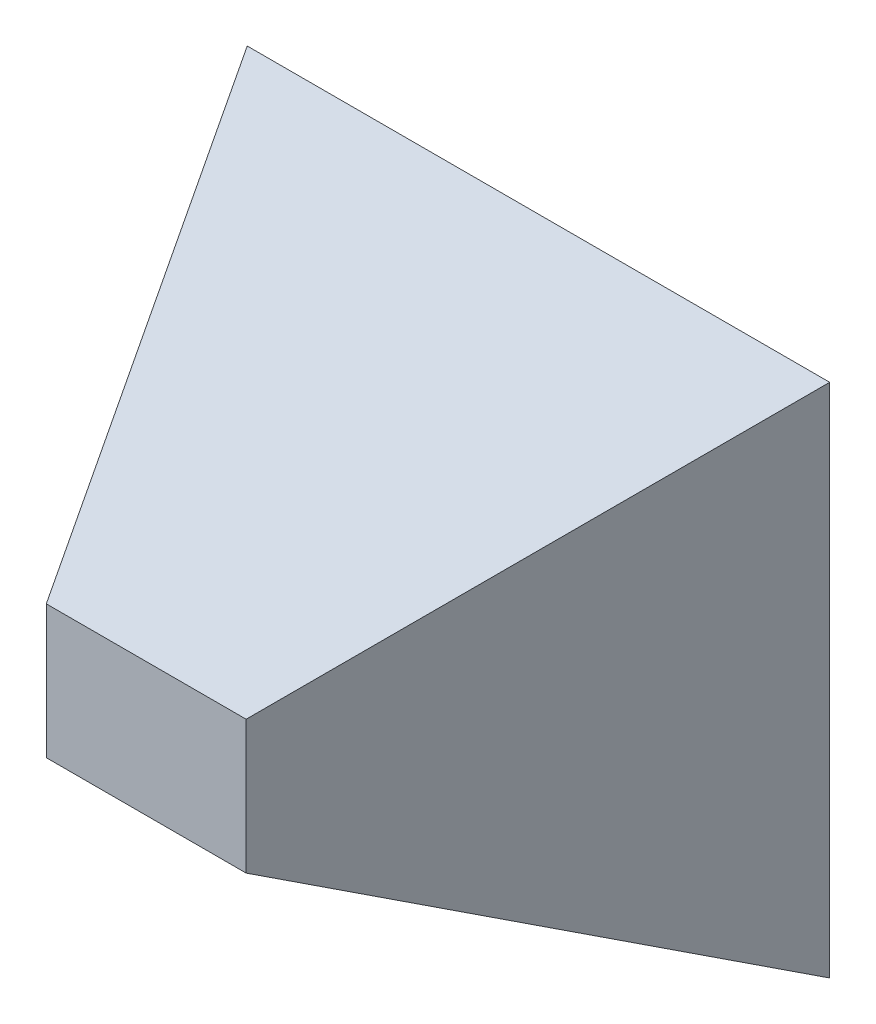
ISO-10303-21;
HEADER;
FILE_DESCRIPTION(('STEP AP214'),'2;1');
FILE_NAME('part.step','',(''),(''),'','','');
FILE_SCHEMA(('AUTOMOTIVE_DESIGN { 1 0 10303 214 1 1 1 1 }'));
ENDSEC;
DATA;
#1=APPLICATION_CONTEXT('core data for automotive mechanical design processes');
#2=APPLICATION_PROTOCOL_DEFINITION('international standard','automotive_design',2000,#1);
#3=PRODUCT_CONTEXT('',#1,'mechanical');
#4=PRODUCT('Part','Part','',(#3));
#5=PRODUCT_RELATED_PRODUCT_CATEGORY('part','',(#4));
#6=PRODUCT_DEFINITION_FORMATION('','',#4);
#7=PRODUCT_DEFINITION_CONTEXT('part definition',#1,'design');
#8=PRODUCT_DEFINITION('design','',#6,#7);
#9=PRODUCT_DEFINITION_SHAPE('','',#8);
#10=(LENGTH_UNIT() NAMED_UNIT(*) SI_UNIT(.MILLI.,.METRE.));
#11=(NAMED_UNIT(*) PLANE_ANGLE_UNIT() SI_UNIT($,.RADIAN.));
#12=(NAMED_UNIT(*) SI_UNIT($,.STERADIAN.) SOLID_ANGLE_UNIT());
#13=UNCERTAINTY_MEASURE_WITH_UNIT(LENGTH_MEASURE(1.E-05),#10,'distance_accuracy_value','');
#14=(GEOMETRIC_REPRESENTATION_CONTEXT(3) GLOBAL_UNCERTAINTY_ASSIGNED_CONTEXT((#13)) GLOBAL_UNIT_ASSIGNED_CONTEXT((#10,
#11,#12)) REPRESENTATION_CONTEXT('',''));
#15=CARTESIAN_POINT('',(0.,0.,0.));
#16=DIRECTION('',(0.,0.,1.));
#17=DIRECTION('',(1.,0.,0.));
#18=AXIS2_PLACEMENT_3D('',#15,#16,#17);
#19=CARTESIAN_POINT('',(-174.101205953701,-155.,-0.438371146789078));
#20=DIRECTION('',(-0.898794046299166,0.,0.438371146789078));
#21=DIRECTION('',(0.438371146789078,0.,0.898794046299167));
#22=AXIS2_PLACEMENT_3D('',#19,#20,#21);
#23=PLANE('',#22);
#24=DIRECTION('',(0.,-1.,0.));
#25=VECTOR('',#24,1.);
#26=CARTESIAN_POINT('',(-173.,-155.,1.81943565045367));
#27=LINE('',#26,#25);
#28=CARTESIAN_POINT('',(-173.,-153.,1.81943565045362));
#29=VERTEX_POINT('',#28);
#30=CARTESIAN_POINT('',(-173.,153.,1.81943565045401));
#31=VERTEX_POINT('',#30);
#32=EDGE_CURVE('E174',#29,#31,#27,.F.);
#33=ORIENTED_EDGE('',*,*,#32,.F.);
#34=DIRECTION('',(-0.401488399504229,-0.401488399504229,-0.823173207853041));
#35=VECTOR('',#34,1.);
#36=CARTESIAN_POINT('',(-117.828557976164,-97.8285579761638,114.937655177394));
#37=LINE('',#36,#35);
#38=CARTESIAN_POINT('',(-173.887398059525,-153.887398059525,0.));
#39=VERTEX_POINT('',#38);
#40=EDGE_CURVE('E184',#29,#39,#37,.T.);
#41=ORIENTED_EDGE('',*,*,#40,.T.);
#42=DIRECTION('',(0.,1.,0.));
#43=VECTOR('',#42,1.);
#44=CARTESIAN_POINT('',(-173.887398059525,-155.,0.));
#45=LINE('',#44,#43);
#46=CARTESIAN_POINT('',(-173.887398059525,153.887398059525,0.));
#47=VERTEX_POINT('',#46);
#48=EDGE_CURVE('E179',#47,#39,#45,.F.);
#49=ORIENTED_EDGE('',*,*,#48,.F.);
#50=DIRECTION('',(-0.401488399504229,0.401488399504229,-0.823173207853041));
#51=VECTOR('',#50,1.);
#52=CARTESIAN_POINT('',(-124.276275373622,104.276275373622,101.717875427967));
#53=LINE('',#52,#51);
#54=EDGE_CURVE('E194',#31,#47,#53,.T.);
#55=ORIENTED_EDGE('',*,*,#54,.F.);
#56=EDGE_LOOP('',(#33,#41,#49,#55));
#57=FACE_BOUND('',#56,.T.);
#58=ADVANCED_FACE('F37',(#57),#23,.F.);
#59=CARTESIAN_POINT('',(175.,-154.101205953701,-0.438371146789078));
#60=DIRECTION('',(0.,-0.898794046299166,0.438371146789078));
#61=DIRECTION('',(0.,-0.438371146789078,-0.898794046299167));
#62=AXIS2_PLACEMENT_3D('',#59,#60,#61);
#63=PLANE('',#62);
#64=DIRECTION('',(1.,0.,0.));
#65=VECTOR('',#64,1.);
#66=CARTESIAN_POINT('',(175.,-153.,1.8194356504535));
#67=LINE('',#66,#65);
#68=CARTESIAN_POINT('',(173.,-153.,1.81943565045379));
#69=VERTEX_POINT('',#68);
#70=EDGE_CURVE('E177',#69,#29,#67,.F.);
#71=ORIENTED_EDGE('',*,*,#70,.F.);
#72=DIRECTION('',(0.401488399504229,-0.401488399504229,-0.823173207853041));
#73=VECTOR('',#72,1.);
#74=CARTESIAN_POINT('',(174.246085203927,-154.246085203927,-0.735417630093364));
#75=LINE('',#74,#73);
#76=CARTESIAN_POINT('',(173.887398059525,-153.887398059525,0.));
#77=VERTEX_POINT('',#76);
#78=EDGE_CURVE('E198',#69,#77,#75,.T.);
#79=ORIENTED_EDGE('',*,*,#78,.T.);
#80=DIRECTION('',(-1.,0.,0.));
#81=VECTOR('',#80,1.);
#82=CARTESIAN_POINT('',(175.,-153.887398059525,0.));
#83=LINE('',#82,#81);
#84=EDGE_CURVE('E209',#39,#77,#83,.F.);
#85=ORIENTED_EDGE('',*,*,#84,.F.);
#86=ORIENTED_EDGE('',*,*,#40,.F.);
#87=EDGE_LOOP('',(#71,#79,#85,#86));
#88=FACE_BOUND('',#87,.T.);
#89=ADVANCED_FACE('F272',(#88),#63,.F.);
#90=CARTESIAN_POINT('',(174.101205953701,-155.,-0.438371146789078));
#91=DIRECTION('',(0.898794046299166,0.,0.438371146789078));
#92=DIRECTION('',(0.438371146789078,0.,-0.898794046299167));
#93=AXIS2_PLACEMENT_3D('',#90,#91,#92);
#94=PLANE('',#93);
#95=DIRECTION('',(0.,1.,0.));
#96=VECTOR('',#95,1.);
#97=CARTESIAN_POINT('',(173.,-155.,1.81943565045379));
#98=LINE('',#97,#96);
#99=CARTESIAN_POINT('',(173.,153.,1.81943565045367));
#100=VERTEX_POINT('',#99);
#101=EDGE_CURVE('E145',#100,#69,#98,.F.);
#102=ORIENTED_EDGE('',*,*,#101,.F.);
#103=DIRECTION('',(0.401488399504229,0.401488399504229,-0.823173207853041));
#104=VECTOR('',#103,1.);
#105=CARTESIAN_POINT('',(174.246085203927,154.246085203927,-0.735417630093364));
#106=LINE('',#105,#104);
#107=CARTESIAN_POINT('',(173.887398059525,153.887398059525,0.));
#108=VERTEX_POINT('',#107);
#109=EDGE_CURVE('E193',#100,#108,#106,.T.);
#110=ORIENTED_EDGE('',*,*,#109,.T.);
#111=DIRECTION('',(0.,-1.,0.));
#112=VECTOR('',#111,1.);
#113=CARTESIAN_POINT('',(173.887398059525,-155.,0.));
#114=LINE('',#113,#112);
#115=EDGE_CURVE('E212',#77,#108,#114,.F.);
#116=ORIENTED_EDGE('',*,*,#115,.F.);
#117=ORIENTED_EDGE('',*,*,#78,.F.);
#118=EDGE_LOOP('',(#102,#110,#116,#117));
#119=FACE_BOUND('',#118,.T.);
#120=ADVANCED_FACE('F266',(#119),#94,.F.);
#121=CARTESIAN_POINT('',(175.,154.101205953701,-0.438371146789078));
#122=DIRECTION('',(0.,0.898794046299166,0.438371146789078));
#123=DIRECTION('',(0.,-0.438371146789078,0.898794046299167));
#124=AXIS2_PLACEMENT_3D('',#121,#122,#123);
#125=PLANE('',#124);
#126=DIRECTION('',(-1.,0.,0.));
#127=VECTOR('',#126,1.);
#128=CARTESIAN_POINT('',(175.,153.,1.81943565045373));
#129=LINE('',#128,#127);
#130=EDGE_CURVE('E11',#31,#100,#129,.F.);
#131=ORIENTED_EDGE('',*,*,#130,.F.);
#132=ORIENTED_EDGE('',*,*,#54,.T.);
#133=DIRECTION('',(1.,0.,0.));
#134=VECTOR('',#133,1.);
#135=CARTESIAN_POINT('',(175.,153.887398059525,0.));
#136=LINE('',#135,#134);
#137=EDGE_CURVE('E189',#108,#47,#136,.F.);
#138=ORIENTED_EDGE('',*,*,#137,.F.);
#139=ORIENTED_EDGE('',*,*,#109,.F.);
#140=EDGE_LOOP('',(#131,#132,#138,#139));
#141=FACE_BOUND('',#140,.T.);
#142=ADVANCED_FACE('F274',(#141),#125,.F.);
#143=CARTESIAN_POINT('',(-175.,-155.,0.));
#144=DIRECTION('',(-0.898794046299166,0.,0.438371146789078));
#145=DIRECTION('',(0.438371146789078,0.,0.898794046299167));
#146=AXIS2_PLACEMENT_3D('',#143,#144,#145);
#147=PLANE('',#146);
#148=DIRECTION('',(0.,-1.,0.));
#149=VECTOR('',#148,1.);
#150=CARTESIAN_POINT('',(-175.,-155.,0.));
#151=LINE('',#150,#149);
#152=CARTESIAN_POINT('',(-175.,155.,0.));
#153=VERTEX_POINT('',#152);
#154=CARTESIAN_POINT('',(-175.,-155.,0.));
#155=VERTEX_POINT('',#154);
#156=EDGE_CURVE('E183',#153,#155,#151,.T.);
#157=ORIENTED_EDGE('',*,*,#156,.T.);
#158=DIRECTION('',(-0.401488399504229,-0.401488399504229,-0.823173207853041));
#159=VECTOR('',#158,1.);
#160=CARTESIAN_POINT('',(-118.582472772236,-98.5824727722365,115.673072807488));
#161=LINE('',#160,#159);
#162=CARTESIAN_POINT('',(-60.0414288750261,-40.0414288750262,235.7));
#163=VERTEX_POINT('',#162);
#164=EDGE_CURVE('E226',#163,#155,#161,.T.);
#165=ORIENTED_EDGE('',*,*,#164,.F.);
#166=DIRECTION('',(0.,1.,0.));
#167=VECTOR('',#166,1.);
#168=CARTESIAN_POINT('',(-60.0414288750261,-155.,235.7));
#169=LINE('',#168,#167);
#170=CARTESIAN_POINT('',(-60.0414288750261,40.0414288750262,235.7));
#171=VERTEX_POINT('',#170);
#172=EDGE_CURVE('E225',#171,#163,#169,.F.);
#173=ORIENTED_EDGE('',*,*,#172,.F.);
#174=DIRECTION('',(-0.401488399504229,0.401488399504229,-0.823173207853041));
#175=VECTOR('',#174,1.);
#176=CARTESIAN_POINT('',(-125.030190169695,105.030190169695,102.453293058061));
#177=LINE('',#176,#175);
#178=EDGE_CURVE('E230',#171,#153,#177,.T.);
#179=ORIENTED_EDGE('',*,*,#178,.T.);
#180=EDGE_LOOP('',(#157,#165,#173,#179));
#181=FACE_BOUND('',#180,.T.);
#182=ADVANCED_FACE('F359',(#181),#147,.T.);
#183=CARTESIAN_POINT('',(175.,-155.,0.));
#184=DIRECTION('',(0.,-0.898794046299166,0.438371146789078));
#185=DIRECTION('',(0.,-0.438371146789078,-0.898794046299167));
#186=AXIS2_PLACEMENT_3D('',#183,#184,#185);
#187=PLANE('',#186);
#188=DIRECTION('',(1.,0.,0.));
#189=VECTOR('',#188,1.);
#190=CARTESIAN_POINT('',(175.,-155.,0.));
#191=LINE('',#190,#189);
#192=CARTESIAN_POINT('',(175.,-155.,0.));
#193=VERTEX_POINT('',#192);
#194=EDGE_CURVE('E219',#155,#193,#191,.T.);
#195=ORIENTED_EDGE('',*,*,#194,.T.);
#196=DIRECTION('',(0.401488399504229,-0.401488399504229,-0.823173207853041));
#197=VECTOR('',#196,1.);
#198=CARTESIAN_POINT('',(175.,-155.,0.));
#199=LINE('',#198,#197);
#200=CARTESIAN_POINT('',(60.0414288750262,-40.0414288750261,235.7));
#201=VERTEX_POINT('',#200);
#202=EDGE_CURVE('E229',#201,#193,#199,.T.);
#203=ORIENTED_EDGE('',*,*,#202,.F.);
#204=DIRECTION('',(-1.,0.,0.));
#205=VECTOR('',#204,1.);
#206=CARTESIAN_POINT('',(175.,-40.0414288750261,235.7));
#207=LINE('',#206,#205);
#208=EDGE_CURVE('E241',#163,#201,#207,.F.);
#209=ORIENTED_EDGE('',*,*,#208,.F.);
#210=ORIENTED_EDGE('',*,*,#164,.T.);
#211=EDGE_LOOP('',(#195,#203,#209,#210));
#212=FACE_BOUND('',#211,.T.);
#213=ADVANCED_FACE('F39',(#212),#187,.T.);
#214=CARTESIAN_POINT('',(175.,-155.,0.));
#215=DIRECTION('',(0.898794046299166,0.,0.438371146789078));
#216=DIRECTION('',(0.438371146789078,0.,-0.898794046299167));
#217=AXIS2_PLACEMENT_3D('',#214,#215,#216);
#218=PLANE('',#217);
#219=DIRECTION('',(0.,1.,0.));
#220=VECTOR('',#219,1.);
#221=CARTESIAN_POINT('',(175.,-155.,0.));
#222=LINE('',#221,#220);
#223=CARTESIAN_POINT('',(175.,155.,0.));
#224=VERTEX_POINT('',#223);
#225=EDGE_CURVE('E221',#193,#224,#222,.T.);
#226=ORIENTED_EDGE('',*,*,#225,.T.);
#227=DIRECTION('',(0.401488399504229,0.401488399504229,-0.823173207853041));
#228=VECTOR('',#227,1.);
#229=CARTESIAN_POINT('',(175.,155.,0.));
#230=LINE('',#229,#228);
#231=CARTESIAN_POINT('',(60.0414288750262,40.0414288750262,235.7));
#232=VERTEX_POINT('',#231);
#233=EDGE_CURVE('E233',#232,#224,#230,.T.);
#234=ORIENTED_EDGE('',*,*,#233,.F.);
#235=DIRECTION('',(0.,-1.,0.));
#236=VECTOR('',#235,1.);
#237=CARTESIAN_POINT('',(60.0414288750262,-155.,235.7));
#238=LINE('',#237,#236);
#239=EDGE_CURVE('E243',#201,#232,#238,.F.);
#240=ORIENTED_EDGE('',*,*,#239,.F.);
#241=ORIENTED_EDGE('',*,*,#202,.T.);
#242=EDGE_LOOP('',(#226,#234,#240,#241));
#243=FACE_BOUND('',#242,.T.);
#244=ADVANCED_FACE('F409',(#243),#218,.T.);
#245=CARTESIAN_POINT('',(175.,155.,0.));
#246=DIRECTION('',(0.,0.898794046299166,0.438371146789078));
#247=DIRECTION('',(0.,-0.438371146789078,0.898794046299167));
#248=AXIS2_PLACEMENT_3D('',#245,#246,#247);
#249=PLANE('',#248);
#250=DIRECTION('',(-1.,0.,0.));
#251=VECTOR('',#250,1.);
#252=CARTESIAN_POINT('',(175.,155.,0.));
#253=LINE('',#252,#251);
#254=EDGE_CURVE('E223',#224,#153,#253,.T.);
#255=ORIENTED_EDGE('',*,*,#254,.T.);
#256=ORIENTED_EDGE('',*,*,#178,.F.);
#257=DIRECTION('',(1.,0.,0.));
#258=VECTOR('',#257,1.);
#259=CARTESIAN_POINT('',(175.,40.0414288750262,235.7));
#260=LINE('',#259,#258);
#261=EDGE_CURVE('E234',#232,#171,#260,.F.);
#262=ORIENTED_EDGE('',*,*,#261,.F.);
#263=ORIENTED_EDGE('',*,*,#233,.T.);
#264=EDGE_LOOP('',(#255,#256,#262,#263));
#265=FACE_BOUND('',#264,.T.);
#266=ADVANCED_FACE('F399',(#265),#249,.T.);
#267=CARTESIAN_POINT('',(0.,0.,235.7));
#268=DIRECTION('',(0.,0.,1.));
#269=DIRECTION('',(1.,0.,0.));
#270=AXIS2_PLACEMENT_3D('',#267,#268,#269);
#271=PLANE('',#270);
#272=ORIENTED_EDGE('',*,*,#172,.T.);
#273=ORIENTED_EDGE('',*,*,#208,.T.);
#274=ORIENTED_EDGE('',*,*,#239,.T.);
#275=ORIENTED_EDGE('',*,*,#261,.T.);
#276=EDGE_LOOP('',(#272,#273,#274,#275));
#277=FACE_BOUND('',#276,.T.);
#278=ADVANCED_FACE('F389',(#277),#271,.T.);
#279=CARTESIAN_POINT('',(0.,0.,0.));
#280=DIRECTION('',(0.,0.,1.));
#281=DIRECTION('',(1.,0.,0.));
#282=AXIS2_PLACEMENT_3D('',#279,#280,#281);
#283=PLANE('',#282);
#284=ORIENTED_EDGE('',*,*,#137,.T.);
#285=ORIENTED_EDGE('',*,*,#48,.T.);
#286=ORIENTED_EDGE('',*,*,#84,.T.);
#287=ORIENTED_EDGE('',*,*,#115,.T.);
#288=EDGE_LOOP('',(#284,#285,#286,#287));
#289=FACE_BOUND('',#288,.T.);
#290=ORIENTED_EDGE('',*,*,#156,.F.);
#291=ORIENTED_EDGE('',*,*,#254,.F.);
#292=ORIENTED_EDGE('',*,*,#225,.F.);
#293=ORIENTED_EDGE('',*,*,#194,.F.);
#294=EDGE_LOOP('',(#290,#291,#292,#293));
#295=FACE_BOUND('',#294,.T.);
#296=ADVANCED_FACE('F349',(#289,#295),#283,.F.);
#297=CARTESIAN_POINT('',(173.,-153.,2.));
#298=DIRECTION('',(1.,0.,0.));
#299=DIRECTION('',(0.,1.,0.));
#300=AXIS2_PLACEMENT_3D('',#297,#298,#299);
#301=PLANE('',#300);
#302=ORIENTED_EDGE('',*,*,#101,.T.);
#303=DIRECTION('',(0.,0.,-1.));
#304=VECTOR('',#303,1.);
#305=CARTESIAN_POINT('',(173.,-153.,2.));
#306=LINE('',#305,#304);
#307=CARTESIAN_POINT('',(173.,-153.,2.));
#308=VERTEX_POINT('',#307);
#309=EDGE_CURVE('E137',#308,#69,#306,.T.);
#310=ORIENTED_EDGE('',*,*,#309,.F.);
#311=DIRECTION('',(0.,-1.,0.));
#312=VECTOR('',#311,1.);
#313=CARTESIAN_POINT('',(173.,-153.,2.));
#314=LINE('',#313,#312);
#315=CARTESIAN_POINT('',(173.,153.,2.));
#316=VERTEX_POINT('',#315);
#317=EDGE_CURVE('E142',#316,#308,#314,.T.);
#318=ORIENTED_EDGE('',*,*,#317,.F.);
#319=DIRECTION('',(0.,0.,-1.));
#320=VECTOR('',#319,1.);
#321=CARTESIAN_POINT('',(173.,153.,2.));
#322=LINE('',#321,#320);
#323=EDGE_CURVE('E165',#316,#100,#322,.T.);
#324=ORIENTED_EDGE('',*,*,#323,.T.);
#325=EDGE_LOOP('',(#302,#310,#318,#324));
#326=FACE_BOUND('',#325,.T.);
#327=ADVANCED_FACE('F139',(#326),#301,.F.);
#328=CARTESIAN_POINT('',(173.,153.,2.));
#329=DIRECTION('',(0.,1.,0.));
#330=DIRECTION('',(0.,0.,1.));
#331=AXIS2_PLACEMENT_3D('',#328,#329,#330);
#332=PLANE('',#331);
#333=ORIENTED_EDGE('',*,*,#130,.T.);
#334=ORIENTED_EDGE('',*,*,#323,.F.);
#335=DIRECTION('',(1.,0.,0.));
#336=VECTOR('',#335,1.);
#337=CARTESIAN_POINT('',(173.,153.,2.));
#338=LINE('',#337,#336);
#339=CARTESIAN_POINT('',(-173.,153.,2.));
#340=VERTEX_POINT('',#339);
#341=EDGE_CURVE('E149',#340,#316,#338,.T.);
#342=ORIENTED_EDGE('',*,*,#341,.F.);
#343=DIRECTION('',(0.,0.,-1.));
#344=VECTOR('',#343,1.);
#345=CARTESIAN_POINT('',(-173.,153.,2.));
#346=LINE('',#345,#344);
#347=EDGE_CURVE('E51',#340,#31,#346,.T.);
#348=ORIENTED_EDGE('',*,*,#347,.T.);
#349=EDGE_LOOP('',(#333,#334,#342,#348));
#350=FACE_BOUND('',#349,.T.);
#351=ADVANCED_FACE('F331',(#350),#332,.F.);
#352=CARTESIAN_POINT('',(-173.,153.,2.));
#353=DIRECTION('',(-1.,0.,0.));
#354=DIRECTION('',(0.,-1.,0.));
#355=AXIS2_PLACEMENT_3D('',#352,#353,#354);
#356=PLANE('',#355);
#357=ORIENTED_EDGE('',*,*,#32,.T.);
#358=ORIENTED_EDGE('',*,*,#347,.F.);
#359=DIRECTION('',(0.,1.,0.));
#360=VECTOR('',#359,1.);
#361=CARTESIAN_POINT('',(-173.,153.,2.));
#362=LINE('',#361,#360);
#363=CARTESIAN_POINT('',(-173.,-153.,2.));
#364=VERTEX_POINT('',#363);
#365=EDGE_CURVE('E158',#364,#340,#362,.T.);
#366=ORIENTED_EDGE('',*,*,#365,.F.);
#367=DIRECTION('',(0.,0.,-1.));
#368=VECTOR('',#367,1.);
#369=CARTESIAN_POINT('',(-173.,-153.,2.));
#370=LINE('',#369,#368);
#371=EDGE_CURVE('E148',#364,#29,#370,.T.);
#372=ORIENTED_EDGE('',*,*,#371,.T.);
#373=EDGE_LOOP('',(#357,#358,#366,#372));
#374=FACE_BOUND('',#373,.T.);
#375=ADVANCED_FACE('F322',(#374),#356,.F.);
#376=CARTESIAN_POINT('',(-173.,-153.,2.));
#377=DIRECTION('',(0.,-1.,0.));
#378=DIRECTION('',(1.,0.,0.));
#379=AXIS2_PLACEMENT_3D('',#376,#377,#378);
#380=PLANE('',#379);
#381=ORIENTED_EDGE('',*,*,#70,.T.);
#382=ORIENTED_EDGE('',*,*,#371,.F.);
#383=DIRECTION('',(-1.,0.,0.));
#384=VECTOR('',#383,1.);
#385=CARTESIAN_POINT('',(-173.,-153.,2.));
#386=LINE('',#385,#384);
#387=EDGE_CURVE('E152',#308,#364,#386,.T.);
#388=ORIENTED_EDGE('',*,*,#387,.F.);
#389=ORIENTED_EDGE('',*,*,#309,.T.);
#390=EDGE_LOOP('',(#381,#382,#388,#389));
#391=FACE_BOUND('',#390,.T.);
#392=ADVANCED_FACE('F153',(#391),#380,.F.);
#393=CARTESIAN_POINT('',(0.,0.,2.));
#394=DIRECTION('',(0.,0.,1.));
#395=DIRECTION('',(1.,0.,0.));
#396=AXIS2_PLACEMENT_3D('',#393,#394,#395);
#397=PLANE('',#396);
#398=DIRECTION('',(0.,1.,0.));
#399=VECTOR('',#398,1.);
#400=CARTESIAN_POINT('',(-172.911932882393,-155.,2.));
#401=LINE('',#400,#399);
#402=CARTESIAN_POINT('',(-172.911932882393,152.911932882393,2.00000000000001));
#403=VERTEX_POINT('',#402);
#404=CARTESIAN_POINT('',(-172.911932882393,-152.911932882393,2.));
#405=VERTEX_POINT('',#404);
#406=EDGE_CURVE('E172',#403,#405,#401,.F.);
#407=ORIENTED_EDGE('',*,*,#406,.T.);
#408=DIRECTION('',(-1.,0.,0.));
#409=VECTOR('',#408,1.);
#410=CARTESIAN_POINT('',(175.,-152.911932882393,2.));
#411=LINE('',#410,#409);
#412=CARTESIAN_POINT('',(172.911932882393,-152.911932882393,2.));
#413=VERTEX_POINT('',#412);
#414=EDGE_CURVE('E170',#405,#413,#411,.F.);
#415=ORIENTED_EDGE('',*,*,#414,.T.);
#416=DIRECTION('',(0.,-1.,0.));
#417=VECTOR('',#416,1.);
#418=CARTESIAN_POINT('',(172.911932882393,-155.,2.));
#419=LINE('',#418,#417);
#420=CARTESIAN_POINT('',(172.911932882393,152.911932882393,2.));
#421=VERTEX_POINT('',#420);
#422=EDGE_CURVE('E59',#413,#421,#419,.F.);
#423=ORIENTED_EDGE('',*,*,#422,.T.);
#424=DIRECTION('',(1.,0.,0.));
#425=VECTOR('',#424,1.);
#426=CARTESIAN_POINT('',(175.,152.911932882393,2.));
#427=LINE('',#426,#425);
#428=EDGE_CURVE('E45',#421,#403,#427,.F.);
#429=ORIENTED_EDGE('',*,*,#428,.T.);
#430=EDGE_LOOP('',(#407,#415,#423,#429));
#431=FACE_BOUND('',#430,.T.);
#432=ORIENTED_EDGE('',*,*,#317,.T.);
#433=ORIENTED_EDGE('',*,*,#387,.T.);
#434=ORIENTED_EDGE('',*,*,#365,.T.);
#435=ORIENTED_EDGE('',*,*,#341,.T.);
#436=EDGE_LOOP('',(#432,#433,#434,#435));
#437=FACE_BOUND('',#436,.T.);
#438=ADVANCED_FACE('F160',(#431,#437),#397,.F.);
#439=CARTESIAN_POINT('',(0.,0.,234.7));
#440=DIRECTION('',(0.,0.,1.));
#441=DIRECTION('',(1.,0.,0.));
#442=AXIS2_PLACEMENT_3D('',#439,#440,#441);
#443=PLANE('',#442);
#444=DIRECTION('',(0.,1.,0.));
#445=VECTOR('',#444,1.);
#446=CARTESIAN_POINT('',(-59.4165595231168,-155.,234.7));
#447=LINE('',#446,#445);
#448=CARTESIAN_POINT('',(-59.4165595231168,39.4165595231168,234.7));
#449=VERTEX_POINT('',#448);
#450=CARTESIAN_POINT('',(-59.4165595231168,-39.4165595231168,234.7));
#451=VERTEX_POINT('',#450);
#452=EDGE_CURVE('E185',#449,#451,#447,.F.);
#453=ORIENTED_EDGE('',*,*,#452,.F.);
#454=DIRECTION('',(1.,0.,0.));
#455=VECTOR('',#454,1.);
#456=CARTESIAN_POINT('',(175.,39.4165595231169,234.7));
#457=LINE('',#456,#455);
#458=CARTESIAN_POINT('',(59.4165595231168,39.4165595231168,234.7));
#459=VERTEX_POINT('',#458);
#460=EDGE_CURVE('E205',#459,#449,#457,.F.);
#461=ORIENTED_EDGE('',*,*,#460,.F.);
#462=DIRECTION('',(0.,-1.,0.));
#463=VECTOR('',#462,1.);
#464=CARTESIAN_POINT('',(59.4165595231169,-155.,234.7));
#465=LINE('',#464,#463);
#466=CARTESIAN_POINT('',(59.4165595231168,-39.4165595231168,234.7));
#467=VERTEX_POINT('',#466);
#468=EDGE_CURVE('E200',#467,#459,#465,.F.);
#469=ORIENTED_EDGE('',*,*,#468,.F.);
#470=DIRECTION('',(-1.,0.,0.));
#471=VECTOR('',#470,1.);
#472=CARTESIAN_POINT('',(175.,-39.4165595231168,234.7));
#473=LINE('',#472,#471);
#474=EDGE_CURVE('E188',#451,#467,#473,.F.);
#475=ORIENTED_EDGE('',*,*,#474,.F.);
#476=EDGE_LOOP('',(#453,#461,#469,#475));
#477=FACE_BOUND('',#476,.T.);
#478=ADVANCED_FACE('F258',(#477),#443,.F.);
#479=ORIENTED_EDGE('',*,*,#428,.F.);
#480=EDGE_CURVE('E201',#459,#421,#106,.T.);
#481=ORIENTED_EDGE('',*,*,#480,.F.);
#482=ORIENTED_EDGE('',*,*,#460,.T.);
#483=EDGE_CURVE('E190',#449,#403,#53,.T.);
#484=ORIENTED_EDGE('',*,*,#483,.T.);
#485=EDGE_LOOP('',(#479,#481,#482,#484));
#486=FACE_BOUND('',#485,.T.);
#487=ADVANCED_FACE('F254',(#486),#125,.F.);
#488=ORIENTED_EDGE('',*,*,#422,.F.);
#489=EDGE_CURVE('E195',#467,#413,#75,.T.);
#490=ORIENTED_EDGE('',*,*,#489,.F.);
#491=ORIENTED_EDGE('',*,*,#468,.T.);
#492=ORIENTED_EDGE('',*,*,#480,.T.);
#493=EDGE_LOOP('',(#488,#490,#491,#492));
#494=FACE_BOUND('',#493,.T.);
#495=ADVANCED_FACE('F263',(#494),#94,.F.);
#496=ORIENTED_EDGE('',*,*,#414,.F.);
#497=EDGE_CURVE('E180',#451,#405,#37,.T.);
#498=ORIENTED_EDGE('',*,*,#497,.F.);
#499=ORIENTED_EDGE('',*,*,#474,.T.);
#500=ORIENTED_EDGE('',*,*,#489,.T.);
#501=EDGE_LOOP('',(#496,#498,#499,#500));
#502=FACE_BOUND('',#501,.T.);
#503=ADVANCED_FACE('F260',(#502),#63,.F.);
#504=ORIENTED_EDGE('',*,*,#406,.F.);
#505=ORIENTED_EDGE('',*,*,#483,.F.);
#506=ORIENTED_EDGE('',*,*,#452,.T.);
#507=ORIENTED_EDGE('',*,*,#497,.T.);
#508=EDGE_LOOP('',(#504,#505,#506,#507));
#509=FACE_BOUND('',#508,.T.);
#510=ADVANCED_FACE('F251',(#509),#23,.F.);
#511=CLOSED_SHELL('',(#58,#89,#120,#142,#182,#213,#244,#266,#278,#296,#327,#351,#375,#392,#438,
#478,#487,#495,#503,#510));
#512=MANIFOLD_SOLID_BREP('B2',#511);
#513=ADVANCED_BREP_SHAPE_REPRESENTATION('',(#18,#512),#14);
#514=SHAPE_DEFINITION_REPRESENTATION(#9,#513);
ENDSEC;
END-ISO-10303-21;
